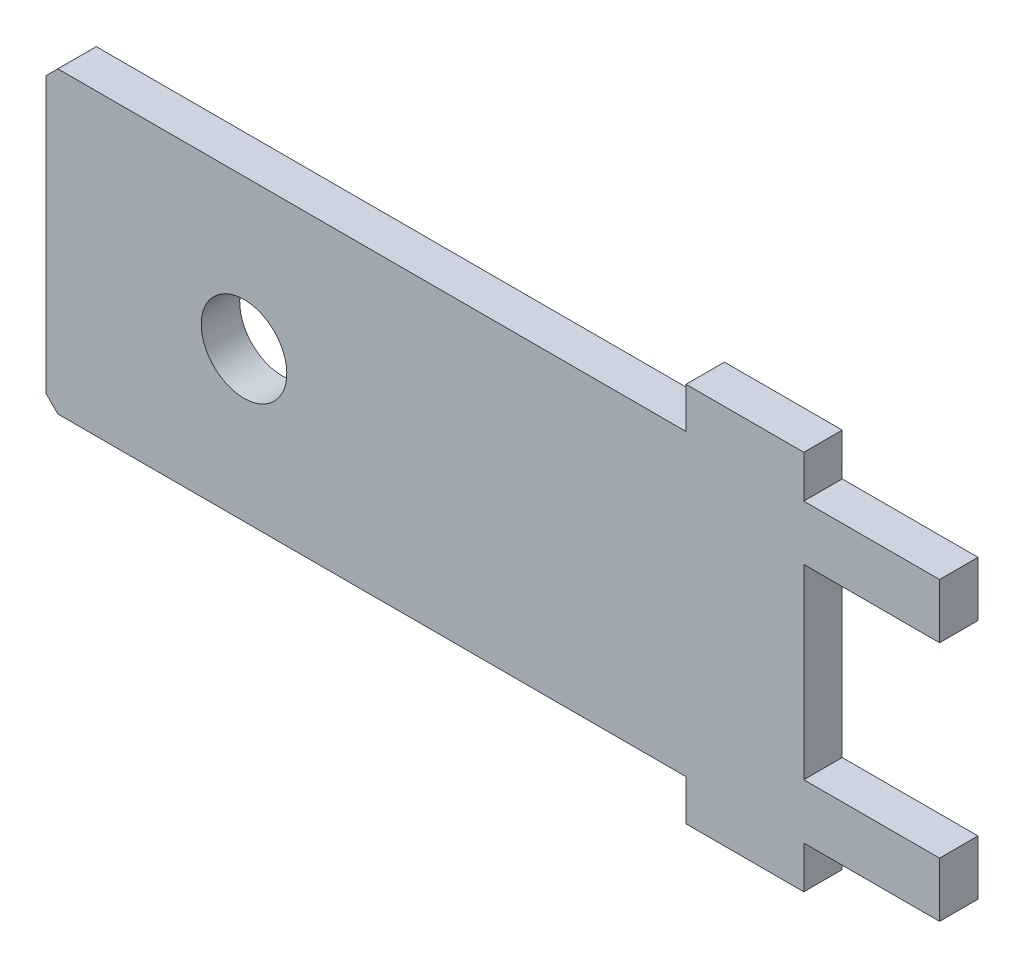
ISO-10303-21;
HEADER;
FILE_DESCRIPTION(('STEP AP214'),'2;1');
FILE_NAME('part.step','',(''),(''),'','','');
FILE_SCHEMA(('AUTOMOTIVE_DESIGN { 1 0 10303 214 1 1 1 1 }'));
ENDSEC;
DATA;
#1=APPLICATION_CONTEXT('core data for automotive mechanical design processes');
#2=APPLICATION_PROTOCOL_DEFINITION('international standard','automotive_design',2000,#1);
#3=PRODUCT_CONTEXT('',#1,'mechanical');
#4=PRODUCT('Part','Part','',(#3));
#5=PRODUCT_RELATED_PRODUCT_CATEGORY('part','',(#4));
#6=PRODUCT_DEFINITION_FORMATION('','',#4);
#7=PRODUCT_DEFINITION_CONTEXT('part definition',#1,'design');
#8=PRODUCT_DEFINITION('design','',#6,#7);
#9=PRODUCT_DEFINITION_SHAPE('','',#8);
#10=(LENGTH_UNIT() NAMED_UNIT(*) SI_UNIT(.MILLI.,.METRE.));
#11=(NAMED_UNIT(*) PLANE_ANGLE_UNIT() SI_UNIT($,.RADIAN.));
#12=(NAMED_UNIT(*) SI_UNIT($,.STERADIAN.) SOLID_ANGLE_UNIT());
#13=UNCERTAINTY_MEASURE_WITH_UNIT(LENGTH_MEASURE(1.E-05),#10,'distance_accuracy_value','');
#14=(GEOMETRIC_REPRESENTATION_CONTEXT(3) GLOBAL_UNCERTAINTY_ASSIGNED_CONTEXT((#13)) GLOBAL_UNIT_ASSIGNED_CONTEXT((#10,
#11,#12)) REPRESENTATION_CONTEXT('',''));
#15=CARTESIAN_POINT('',(0.,0.,0.));
#16=DIRECTION('',(0.,0.,1.));
#17=DIRECTION('',(1.,0.,0.));
#18=AXIS2_PLACEMENT_3D('',#15,#16,#17);
#19=CARTESIAN_POINT('',(-0.0340000000000023,-1.94,0.8));
#20=DIRECTION('',(-1.,0.,0.));
#21=DIRECTION('',(0.,0.,1.));
#22=AXIS2_PLACEMENT_3D('',#19,#20,#21);
#23=PLANE('',#22);
#24=DIRECTION('',(0.,1.,0.));
#25=VECTOR('',#24,1.);
#26=CARTESIAN_POINT('',(-0.0340000000000023,-1.94,0.));
#27=LINE('',#26,#25);
#28=CARTESIAN_POINT('',(-0.0340000000000023,-1.94,0.));
#29=VERTEX_POINT('',#28);
#30=CARTESIAN_POINT('',(-0.0340000000000023,1.94,0.));
#31=VERTEX_POINT('',#30);
#32=EDGE_CURVE('E186',#29,#31,#27,.T.);
#33=ORIENTED_EDGE('',*,*,#32,.T.);
#34=DIRECTION('',(0.,0.,-1.));
#35=VECTOR('',#34,1.);
#36=CARTESIAN_POINT('',(-0.0340000000000023,1.94,0.8));
#37=LINE('',#36,#35);
#38=CARTESIAN_POINT('',(-0.0340000000000023,1.94,0.8));
#39=VERTEX_POINT('',#38);
#40=EDGE_CURVE('E167',#39,#31,#37,.T.);
#41=ORIENTED_EDGE('',*,*,#40,.F.);
#42=DIRECTION('',(0.,1.,0.));
#43=VECTOR('',#42,1.);
#44=CARTESIAN_POINT('',(-0.0340000000000023,-1.94,0.8));
#45=LINE('',#44,#43);
#46=CARTESIAN_POINT('',(-0.0340000000000023,-1.94,0.8));
#47=VERTEX_POINT('',#46);
#48=EDGE_CURVE('E174',#47,#39,#45,.T.);
#49=ORIENTED_EDGE('',*,*,#48,.F.);
#50=DIRECTION('',(0.,0.,-1.));
#51=VECTOR('',#50,1.);
#52=CARTESIAN_POINT('',(-0.0340000000000023,-1.94,0.8));
#53=LINE('',#52,#51);
#54=EDGE_CURVE('E237',#47,#29,#53,.T.);
#55=ORIENTED_EDGE('',*,*,#54,.T.);
#56=EDGE_LOOP('',(#33,#41,#49,#55));
#57=FACE_BOUND('',#56,.T.);
#58=ADVANCED_FACE('F33',(#57),#23,.F.);
#59=CARTESIAN_POINT('',(-0.0340000000000023,1.94,0.8));
#60=DIRECTION('',(0.,1.,0.));
#61=DIRECTION('',(-1.,0.,0.));
#62=AXIS2_PLACEMENT_3D('',#59,#60,#61);
#63=PLANE('',#62);
#64=DIRECTION('',(1.,0.,0.));
#65=VECTOR('',#64,1.);
#66=CARTESIAN_POINT('',(-0.0340000000000023,1.94,0.));
#67=LINE('',#66,#65);
#68=CARTESIAN_POINT('',(2.79108259057112,1.94,0.));
#69=VERTEX_POINT('',#68);
#70=EDGE_CURVE('E239',#31,#69,#67,.T.);
#71=ORIENTED_EDGE('',*,*,#70,.T.);
#72=DIRECTION('',(0.,0.,-1.));
#73=VECTOR('',#72,1.);
#74=CARTESIAN_POINT('',(2.79108259057112,1.94,0.8));
#75=LINE('',#74,#73);
#76=CARTESIAN_POINT('',(2.79108259057112,1.94,0.8));
#77=VERTEX_POINT('',#76);
#78=EDGE_CURVE('E170',#77,#69,#75,.T.);
#79=ORIENTED_EDGE('',*,*,#78,.F.);
#80=DIRECTION('',(1.,0.,0.));
#81=VECTOR('',#80,1.);
#82=CARTESIAN_POINT('',(-0.0340000000000023,1.94,0.8));
#83=LINE('',#82,#81);
#84=EDGE_CURVE('E163',#39,#77,#83,.T.);
#85=ORIENTED_EDGE('',*,*,#84,.F.);
#86=ORIENTED_EDGE('',*,*,#40,.T.);
#87=EDGE_LOOP('',(#71,#79,#85,#86));
#88=FACE_BOUND('',#87,.T.);
#89=ADVANCED_FACE('F165',(#88),#63,.F.);
#90=CARTESIAN_POINT('',(2.79108259057112,3.08,0.8));
#91=DIRECTION('',(-1.,0.,0.));
#92=DIRECTION('',(0.,-1.,0.));
#93=AXIS2_PLACEMENT_3D('',#90,#91,#92);
#94=PLANE('',#93);
#95=DIRECTION('',(0.,1.,0.));
#96=VECTOR('',#95,1.);
#97=CARTESIAN_POINT('',(2.79108259057112,3.08,0.));
#98=LINE('',#97,#96);
#99=CARTESIAN_POINT('',(2.79108259057112,3.08,0.));
#100=VERTEX_POINT('',#99);
#101=EDGE_CURVE('E242',#69,#100,#98,.T.);
#102=ORIENTED_EDGE('',*,*,#101,.T.);
#103=DIRECTION('',(0.,0.,-1.));
#104=VECTOR('',#103,1.);
#105=CARTESIAN_POINT('',(2.79108259057112,3.08,0.8));
#106=LINE('',#105,#104);
#107=CARTESIAN_POINT('',(2.79108259057112,3.08,0.8));
#108=VERTEX_POINT('',#107);
#109=EDGE_CURVE('E191',#108,#100,#106,.T.);
#110=ORIENTED_EDGE('',*,*,#109,.F.);
#111=DIRECTION('',(0.,1.,0.));
#112=VECTOR('',#111,1.);
#113=CARTESIAN_POINT('',(2.79108259057112,3.08,0.8));
#114=LINE('',#113,#112);
#115=EDGE_CURVE('E173',#77,#108,#114,.T.);
#116=ORIENTED_EDGE('',*,*,#115,.F.);
#117=ORIENTED_EDGE('',*,*,#78,.T.);
#118=EDGE_LOOP('',(#102,#110,#116,#117));
#119=FACE_BOUND('',#118,.T.);
#120=ADVANCED_FACE('F367',(#119),#94,.F.);
#121=CARTESIAN_POINT('',(-0.0340000000000027,3.08,0.8));
#122=DIRECTION('',(0.,-1.,0.));
#123=DIRECTION('',(0.,0.,-1.));
#124=AXIS2_PLACEMENT_3D('',#121,#122,#123);
#125=PLANE('',#124);
#126=DIRECTION('',(-1.,0.,0.));
#127=VECTOR('',#126,1.);
#128=CARTESIAN_POINT('',(-0.0340000000000027,3.08,0.));
#129=LINE('',#128,#127);
#130=CARTESIAN_POINT('',(-0.0340000000000027,3.08,0.));
#131=VERTEX_POINT('',#130);
#132=EDGE_CURVE('E244',#100,#131,#129,.T.);
#133=ORIENTED_EDGE('',*,*,#132,.T.);
#134=DIRECTION('',(0.,0.,-1.));
#135=VECTOR('',#134,1.);
#136=CARTESIAN_POINT('',(-0.0340000000000027,3.08,0.8));
#137=LINE('',#136,#135);
#138=CARTESIAN_POINT('',(-0.0340000000000027,3.08,0.8));
#139=VERTEX_POINT('',#138);
#140=EDGE_CURVE('E305',#139,#131,#137,.T.);
#141=ORIENTED_EDGE('',*,*,#140,.F.);
#142=DIRECTION('',(-1.,0.,0.));
#143=VECTOR('',#142,1.);
#144=CARTESIAN_POINT('',(-0.0340000000000027,3.08,0.8));
#145=LINE('',#144,#143);
#146=EDGE_CURVE('E314',#108,#139,#145,.T.);
#147=ORIENTED_EDGE('',*,*,#146,.F.);
#148=ORIENTED_EDGE('',*,*,#109,.T.);
#149=EDGE_LOOP('',(#133,#141,#147,#148));
#150=FACE_BOUND('',#149,.T.);
#151=ADVANCED_FACE('F312',(#150),#125,.F.);
#152=CARTESIAN_POINT('',(-0.0340000000000027,3.08,0.8));
#153=DIRECTION('',(-1.,0.,0.));
#154=DIRECTION('',(0.,-1.,0.));
#155=AXIS2_PLACEMENT_3D('',#152,#153,#154);
#156=PLANE('',#155);
#157=DIRECTION('',(0.,1.,0.));
#158=VECTOR('',#157,1.);
#159=CARTESIAN_POINT('',(-0.0340000000000027,3.08,0.));
#160=LINE('',#159,#158);
#161=CARTESIAN_POINT('',(-0.0339999999999997,3.96,0.));
#162=VERTEX_POINT('',#161);
#163=EDGE_CURVE('E246',#131,#162,#160,.T.);
#164=ORIENTED_EDGE('',*,*,#163,.T.);
#165=DIRECTION('',(0.,0.,-1.));
#166=VECTOR('',#165,1.);
#167=CARTESIAN_POINT('',(-0.0339999999999997,3.96,0.8));
#168=LINE('',#167,#166);
#169=CARTESIAN_POINT('',(-0.0339999999999997,3.96,0.8));
#170=VERTEX_POINT('',#169);
#171=EDGE_CURVE('E302',#170,#162,#168,.T.);
#172=ORIENTED_EDGE('',*,*,#171,.F.);
#173=DIRECTION('',(0.,1.,0.));
#174=VECTOR('',#173,1.);
#175=CARTESIAN_POINT('',(-0.0340000000000027,3.08,0.8));
#176=LINE('',#175,#174);
#177=EDGE_CURVE('E332',#139,#170,#176,.T.);
#178=ORIENTED_EDGE('',*,*,#177,.F.);
#179=ORIENTED_EDGE('',*,*,#140,.T.);
#180=EDGE_LOOP('',(#164,#172,#178,#179));
#181=FACE_BOUND('',#180,.T.);
#182=ADVANCED_FACE('F324',(#181),#156,.F.);
#183=CARTESIAN_POINT('',(-0.0339999999999997,3.96,0.8));
#184=DIRECTION('',(0.,-1.,0.));
#185=DIRECTION('',(0.,0.,-1.));
#186=AXIS2_PLACEMENT_3D('',#183,#184,#185);
#187=PLANE('',#186);
#188=DIRECTION('',(-1.,0.,0.));
#189=VECTOR('',#188,1.);
#190=CARTESIAN_POINT('',(-0.0339999999999997,3.96,0.));
#191=LINE('',#190,#189);
#192=CARTESIAN_POINT('',(-2.484,3.96,0.));
#193=VERTEX_POINT('',#192);
#194=EDGE_CURVE('E248',#162,#193,#191,.T.);
#195=ORIENTED_EDGE('',*,*,#194,.T.);
#196=DIRECTION('',(0.,0.,-1.));
#197=VECTOR('',#196,1.);
#198=CARTESIAN_POINT('',(-2.484,3.96,0.8));
#199=LINE('',#198,#197);
#200=CARTESIAN_POINT('',(-2.484,3.96,0.8));
#201=VERTEX_POINT('',#200);
#202=EDGE_CURVE('E299',#201,#193,#199,.T.);
#203=ORIENTED_EDGE('',*,*,#202,.F.);
#204=DIRECTION('',(-1.,0.,0.));
#205=VECTOR('',#204,1.);
#206=CARTESIAN_POINT('',(-0.0339999999999997,3.96,0.8));
#207=LINE('',#206,#205);
#208=EDGE_CURVE('E330',#170,#201,#207,.T.);
#209=ORIENTED_EDGE('',*,*,#208,.F.);
#210=ORIENTED_EDGE('',*,*,#171,.T.);
#211=EDGE_LOOP('',(#195,#203,#209,#210));
#212=FACE_BOUND('',#211,.T.);
#213=ADVANCED_FACE('F328',(#212),#187,.F.);
#214=CARTESIAN_POINT('',(-2.484,3.96,0.8));
#215=DIRECTION('',(1.,0.,0.));
#216=DIRECTION('',(0.,0.,-1.));
#217=AXIS2_PLACEMENT_3D('',#214,#215,#216);
#218=PLANE('',#217);
#219=DIRECTION('',(0.,-1.,0.));
#220=VECTOR('',#219,1.);
#221=CARTESIAN_POINT('',(-2.484,3.96,0.));
#222=LINE('',#221,#220);
#223=CARTESIAN_POINT('',(-2.484,3.11,0.));
#224=VERTEX_POINT('',#223);
#225=EDGE_CURVE('E250',#193,#224,#222,.T.);
#226=ORIENTED_EDGE('',*,*,#225,.T.);
#227=DIRECTION('',(0.,0.,-1.));
#228=VECTOR('',#227,1.);
#229=CARTESIAN_POINT('',(-2.484,3.11,0.8));
#230=LINE('',#229,#228);
#231=CARTESIAN_POINT('',(-2.484,3.11,0.8));
#232=VERTEX_POINT('',#231);
#233=EDGE_CURVE('E296',#232,#224,#230,.T.);
#234=ORIENTED_EDGE('',*,*,#233,.F.);
#235=DIRECTION('',(0.,-1.,0.));
#236=VECTOR('',#235,1.);
#237=CARTESIAN_POINT('',(-2.484,3.96,0.8));
#238=LINE('',#237,#236);
#239=EDGE_CURVE('E221',#201,#232,#238,.T.);
#240=ORIENTED_EDGE('',*,*,#239,.F.);
#241=ORIENTED_EDGE('',*,*,#202,.T.);
#242=EDGE_LOOP('',(#226,#234,#240,#241));
#243=FACE_BOUND('',#242,.T.);
#244=ADVANCED_FACE('F488',(#243),#218,.F.);
#245=CARTESIAN_POINT('',(-2.484,3.11,0.8));
#246=DIRECTION('',(0.,-1.,0.));
#247=DIRECTION('',(0.,0.,-1.));
#248=AXIS2_PLACEMENT_3D('',#245,#246,#247);
#249=PLANE('',#248);
#250=DIRECTION('',(-1.,0.,0.));
#251=VECTOR('',#250,1.);
#252=CARTESIAN_POINT('',(-2.484,3.11,0.));
#253=LINE('',#252,#251);
#254=CARTESIAN_POINT('',(-15.5531599594194,3.11,0.));
#255=VERTEX_POINT('',#254);
#256=EDGE_CURVE('E252',#224,#255,#253,.T.);
#257=ORIENTED_EDGE('',*,*,#256,.T.);
#258=DIRECTION('',(0.,0.,-1.));
#259=VECTOR('',#258,1.);
#260=CARTESIAN_POINT('',(-15.5531599594194,3.11,0.8));
#261=LINE('',#260,#259);
#262=CARTESIAN_POINT('',(-15.5531599594194,3.11,0.8));
#263=VERTEX_POINT('',#262);
#264=EDGE_CURVE('E294',#263,#255,#261,.T.);
#265=ORIENTED_EDGE('',*,*,#264,.F.);
#266=DIRECTION('',(-1.,0.,0.));
#267=VECTOR('',#266,1.);
#268=CARTESIAN_POINT('',(-2.484,3.11,0.8));
#269=LINE('',#268,#267);
#270=EDGE_CURVE('E215',#232,#263,#269,.T.);
#271=ORIENTED_EDGE('',*,*,#270,.F.);
#272=ORIENTED_EDGE('',*,*,#233,.T.);
#273=EDGE_LOOP('',(#257,#265,#271,#272));
#274=FACE_BOUND('',#273,.T.);
#275=ADVANCED_FACE('F408',(#274),#249,.F.);
#276=CARTESIAN_POINT('',(-16.2,2.46435108659646,0.8));
#277=DIRECTION('',(0.706454828344419,-0.707758133481246,0.));
#278=DIRECTION('',(0.707758133481246,0.706454828344419,0.));
#279=AXIS2_PLACEMENT_3D('',#276,#277,#278);
#280=PLANE('',#279);
#281=DIRECTION('',(-0.577704657206457,-0.576640839764187,0.577704657206452));
#282=VECTOR('',#281,1.);
#283=CARTESIAN_POINT('',(-16.2,2.46435108659646,0.400000000000001));
#284=LINE('',#283,#282);
#285=CARTESIAN_POINT('',(-15.8,2.86361450437993,0.));
#286=VERTEX_POINT('',#285);
#287=CARTESIAN_POINT('',(-16.2,2.46435108659646,0.400000000000001));
#288=VERTEX_POINT('',#287);
#289=EDGE_CURVE('E198',#286,#288,#284,.T.);
#290=ORIENTED_EDGE('',*,*,#289,.T.);
#291=DIRECTION('',(-0.577704657206455,-0.576640839764185,-0.577704657206455));
#292=VECTOR('',#291,1.);
#293=CARTESIAN_POINT('',(-15.7279159112649,2.93556585347036,0.872084088735078));
#294=LINE('',#293,#292);
#295=CARTESIAN_POINT('',(-15.8,2.86361450437992,0.8));
#296=VERTEX_POINT('',#295);
#297=EDGE_CURVE('E11',#288,#296,#294,.F.);
#298=ORIENTED_EDGE('',*,*,#297,.T.);
#299=DIRECTION('',(-0.707758133481246,-0.706454828344419,0.));
#300=VECTOR('',#299,1.);
#301=CARTESIAN_POINT('',(-16.2,2.46435108659646,0.8));
#302=LINE('',#301,#300);
#303=EDGE_CURVE('E213',#263,#296,#302,.T.);
#304=ORIENTED_EDGE('',*,*,#303,.F.);
#305=ORIENTED_EDGE('',*,*,#264,.T.);
#306=DIRECTION('',(-0.707758133481246,-0.706454828344419,0.));
#307=VECTOR('',#306,1.);
#308=CARTESIAN_POINT('',(-16.2,2.46435108659646,0.));
#309=LINE('',#308,#307);
#310=EDGE_CURVE('E254',#255,#286,#309,.T.);
#311=ORIENTED_EDGE('',*,*,#310,.T.);
#312=EDGE_LOOP('',(#290,#298,#304,#305,#311));
#313=FACE_BOUND('',#312,.T.);
#314=ADVANCED_FACE('F397',(#313),#280,.F.);
#315=CARTESIAN_POINT('',(-16.2,-2.46435108659645,0.8));
#316=DIRECTION('',(0.706454828344419,0.707758133481246,0.));
#317=DIRECTION('',(-0.707758133481246,0.706454828344419,0.));
#318=AXIS2_PLACEMENT_3D('',#315,#316,#317);
#319=PLANE('',#318);
#320=DIRECTION('',(0.707758133481246,-0.706454828344419,0.));
#321=VECTOR('',#320,1.);
#322=CARTESIAN_POINT('',(-16.2,-2.46435108659645,0.8));
#323=LINE('',#322,#321);
#324=CARTESIAN_POINT('',(-15.8,-2.86361450437992,0.8));
#325=VERTEX_POINT('',#324);
#326=CARTESIAN_POINT('',(-15.5531599594194,-3.11,0.8));
#327=VERTEX_POINT('',#326);
#328=EDGE_CURVE('E207',#325,#327,#323,.T.);
#329=ORIENTED_EDGE('',*,*,#328,.F.);
#330=DIRECTION('',(0.577704657206455,-0.576640839764185,0.577704657206455));
#331=VECTOR('',#330,1.);
#332=CARTESIAN_POINT('',(-17.7799849990549,-0.887275559673258,-1.17998499905494));
#333=LINE('',#332,#331);
#334=CARTESIAN_POINT('',(-16.2,-2.46435108659645,0.400000000000001));
#335=VERTEX_POINT('',#334);
#336=EDGE_CURVE('E41',#325,#335,#333,.F.);
#337=ORIENTED_EDGE('',*,*,#336,.T.);
#338=DIRECTION('',(0.577704657206457,-0.576640839764187,-0.577704657206452));
#339=VECTOR('',#338,1.);
#340=CARTESIAN_POINT('',(-17.8418891838527,-0.825485368679609,2.0418891838527));
#341=LINE('',#340,#339);
#342=CARTESIAN_POINT('',(-15.8,-2.86361450437992,0.));
#343=VERTEX_POINT('',#342);
#344=EDGE_CURVE('E189',#335,#343,#341,.T.);
#345=ORIENTED_EDGE('',*,*,#344,.T.);
#346=DIRECTION('',(0.707758133481246,-0.706454828344419,0.));
#347=VECTOR('',#346,1.);
#348=CARTESIAN_POINT('',(-16.2,-2.46435108659645,0.));
#349=LINE('',#348,#347);
#350=CARTESIAN_POINT('',(-15.5531599594194,-3.11,0.));
#351=VERTEX_POINT('',#350);
#352=EDGE_CURVE('E257',#343,#351,#349,.T.);
#353=ORIENTED_EDGE('',*,*,#352,.T.);
#354=DIRECTION('',(0.,0.,-1.));
#355=VECTOR('',#354,1.);
#356=CARTESIAN_POINT('',(-15.5531599594194,-3.11,0.8));
#357=LINE('',#356,#355);
#358=EDGE_CURVE('E291',#327,#351,#357,.T.);
#359=ORIENTED_EDGE('',*,*,#358,.F.);
#360=EDGE_LOOP('',(#329,#337,#345,#353,#359));
#361=FACE_BOUND('',#360,.T.);
#362=ADVANCED_FACE('F204',(#361),#319,.F.);
#363=CARTESIAN_POINT('',(-2.484,-3.11,0.8));
#364=DIRECTION('',(0.,1.,0.));
#365=DIRECTION('',(0.,0.,1.));
#366=AXIS2_PLACEMENT_3D('',#363,#364,#365);
#367=PLANE('',#366);
#368=DIRECTION('',(1.,0.,0.));
#369=VECTOR('',#368,1.);
#370=CARTESIAN_POINT('',(-2.484,-3.11,0.));
#371=LINE('',#370,#369);
#372=CARTESIAN_POINT('',(-2.484,-3.11,0.));
#373=VERTEX_POINT('',#372);
#374=EDGE_CURVE('E259',#351,#373,#371,.T.);
#375=ORIENTED_EDGE('',*,*,#374,.T.);
#376=DIRECTION('',(0.,0.,-1.));
#377=VECTOR('',#376,1.);
#378=CARTESIAN_POINT('',(-2.484,-3.11,0.8));
#379=LINE('',#378,#377);
#380=CARTESIAN_POINT('',(-2.484,-3.11,0.8));
#381=VERTEX_POINT('',#380);
#382=EDGE_CURVE('E288',#381,#373,#379,.T.);
#383=ORIENTED_EDGE('',*,*,#382,.F.);
#384=DIRECTION('',(1.,0.,0.));
#385=VECTOR('',#384,1.);
#386=CARTESIAN_POINT('',(-2.484,-3.11,0.8));
#387=LINE('',#386,#385);
#388=EDGE_CURVE('E219',#327,#381,#387,.T.);
#389=ORIENTED_EDGE('',*,*,#388,.F.);
#390=ORIENTED_EDGE('',*,*,#358,.T.);
#391=EDGE_LOOP('',(#375,#383,#389,#390));
#392=FACE_BOUND('',#391,.T.);
#393=ADVANCED_FACE('F396',(#392),#367,.F.);
#394=CARTESIAN_POINT('',(-2.484,-3.96,0.8));
#395=DIRECTION('',(1.,0.,0.));
#396=DIRECTION('',(0.,0.,-1.));
#397=AXIS2_PLACEMENT_3D('',#394,#395,#396);
#398=PLANE('',#397);
#399=DIRECTION('',(0.,-1.,0.));
#400=VECTOR('',#399,1.);
#401=CARTESIAN_POINT('',(-2.484,-3.96,0.));
#402=LINE('',#401,#400);
#403=CARTESIAN_POINT('',(-2.484,-3.96,0.));
#404=VERTEX_POINT('',#403);
#405=EDGE_CURVE('E261',#373,#404,#402,.T.);
#406=ORIENTED_EDGE('',*,*,#405,.T.);
#407=DIRECTION('',(0.,0.,-1.));
#408=VECTOR('',#407,1.);
#409=CARTESIAN_POINT('',(-2.484,-3.96,0.8));
#410=LINE('',#409,#408);
#411=CARTESIAN_POINT('',(-2.484,-3.96,0.8));
#412=VERTEX_POINT('',#411);
#413=EDGE_CURVE('E285',#412,#404,#410,.T.);
#414=ORIENTED_EDGE('',*,*,#413,.F.);
#415=DIRECTION('',(0.,-1.,0.));
#416=VECTOR('',#415,1.);
#417=CARTESIAN_POINT('',(-2.484,-3.96,0.8));
#418=LINE('',#417,#416);
#419=EDGE_CURVE('E226',#381,#412,#418,.T.);
#420=ORIENTED_EDGE('',*,*,#419,.F.);
#421=ORIENTED_EDGE('',*,*,#382,.T.);
#422=EDGE_LOOP('',(#406,#414,#420,#421));
#423=FACE_BOUND('',#422,.T.);
#424=ADVANCED_FACE('F464',(#423),#398,.F.);
#425=CARTESIAN_POINT('',(-0.0339999999999997,-3.96,0.8));
#426=DIRECTION('',(0.,1.,0.));
#427=DIRECTION('',(0.,0.,1.));
#428=AXIS2_PLACEMENT_3D('',#425,#426,#427);
#429=PLANE('',#428);
#430=DIRECTION('',(1.,0.,0.));
#431=VECTOR('',#430,1.);
#432=CARTESIAN_POINT('',(-0.0339999999999997,-3.96,0.));
#433=LINE('',#432,#431);
#434=CARTESIAN_POINT('',(-0.0339999999999997,-3.96,0.));
#435=VERTEX_POINT('',#434);
#436=EDGE_CURVE('E263',#404,#435,#433,.T.);
#437=ORIENTED_EDGE('',*,*,#436,.T.);
#438=DIRECTION('',(0.,0.,-1.));
#439=VECTOR('',#438,1.);
#440=CARTESIAN_POINT('',(-0.0339999999999997,-3.96,0.8));
#441=LINE('',#440,#439);
#442=CARTESIAN_POINT('',(-0.0339999999999997,-3.96,0.8));
#443=VERTEX_POINT('',#442);
#444=EDGE_CURVE('E282',#443,#435,#441,.T.);
#445=ORIENTED_EDGE('',*,*,#444,.F.);
#446=DIRECTION('',(1.,0.,0.));
#447=VECTOR('',#446,1.);
#448=CARTESIAN_POINT('',(-0.0339999999999997,-3.96,0.8));
#449=LINE('',#448,#447);
#450=EDGE_CURVE('E228',#412,#443,#449,.T.);
#451=ORIENTED_EDGE('',*,*,#450,.F.);
#452=ORIENTED_EDGE('',*,*,#413,.T.);
#453=EDGE_LOOP('',(#437,#445,#451,#452));
#454=FACE_BOUND('',#453,.T.);
#455=ADVANCED_FACE('F454',(#454),#429,.F.);
#456=CARTESIAN_POINT('',(-0.0339999999999997,-3.96,0.8));
#457=DIRECTION('',(-1.,0.,0.));
#458=DIRECTION('',(0.,-1.,0.));
#459=AXIS2_PLACEMENT_3D('',#456,#457,#458);
#460=PLANE('',#459);
#461=DIRECTION('',(0.,1.,0.));
#462=VECTOR('',#461,1.);
#463=CARTESIAN_POINT('',(-0.0339999999999997,-3.96,0.));
#464=LINE('',#463,#462);
#465=CARTESIAN_POINT('',(-0.0340000000000027,-3.08,0.));
#466=VERTEX_POINT('',#465);
#467=EDGE_CURVE('E265',#435,#466,#464,.T.);
#468=ORIENTED_EDGE('',*,*,#467,.T.);
#469=DIRECTION('',(0.,0.,-1.));
#470=VECTOR('',#469,1.);
#471=CARTESIAN_POINT('',(-0.0340000000000027,-3.08,0.8));
#472=LINE('',#471,#470);
#473=CARTESIAN_POINT('',(-0.0340000000000027,-3.08,0.8));
#474=VERTEX_POINT('',#473);
#475=EDGE_CURVE('E279',#474,#466,#472,.T.);
#476=ORIENTED_EDGE('',*,*,#475,.F.);
#477=DIRECTION('',(0.,1.,0.));
#478=VECTOR('',#477,1.);
#479=CARTESIAN_POINT('',(-0.0339999999999997,-3.96,0.8));
#480=LINE('',#479,#478);
#481=EDGE_CURVE('E230',#443,#474,#480,.T.);
#482=ORIENTED_EDGE('',*,*,#481,.F.);
#483=ORIENTED_EDGE('',*,*,#444,.T.);
#484=EDGE_LOOP('',(#468,#476,#482,#483));
#485=FACE_BOUND('',#484,.T.);
#486=ADVANCED_FACE('F444',(#485),#460,.F.);
#487=CARTESIAN_POINT('',(-0.0340000000000027,-3.08,0.8));
#488=DIRECTION('',(0.,1.,0.));
#489=DIRECTION('',(0.,0.,1.));
#490=AXIS2_PLACEMENT_3D('',#487,#488,#489);
#491=PLANE('',#490);
#492=DIRECTION('',(1.,0.,0.));
#493=VECTOR('',#492,1.);
#494=CARTESIAN_POINT('',(-0.0340000000000027,-3.08,0.));
#495=LINE('',#494,#493);
#496=CARTESIAN_POINT('',(2.79108259057112,-3.08,0.));
#497=VERTEX_POINT('',#496);
#498=EDGE_CURVE('E267',#466,#497,#495,.T.);
#499=ORIENTED_EDGE('',*,*,#498,.T.);
#500=DIRECTION('',(0.,0.,-1.));
#501=VECTOR('',#500,1.);
#502=CARTESIAN_POINT('',(2.79108259057112,-3.08,0.8));
#503=LINE('',#502,#501);
#504=CARTESIAN_POINT('',(2.79108259057112,-3.08,0.8));
#505=VERTEX_POINT('',#504);
#506=EDGE_CURVE('E276',#505,#497,#503,.T.);
#507=ORIENTED_EDGE('',*,*,#506,.F.);
#508=DIRECTION('',(1.,0.,0.));
#509=VECTOR('',#508,1.);
#510=CARTESIAN_POINT('',(-0.0340000000000027,-3.08,0.8));
#511=LINE('',#510,#509);
#512=EDGE_CURVE('E232',#474,#505,#511,.T.);
#513=ORIENTED_EDGE('',*,*,#512,.F.);
#514=ORIENTED_EDGE('',*,*,#475,.T.);
#515=EDGE_LOOP('',(#499,#507,#513,#514));
#516=FACE_BOUND('',#515,.T.);
#517=ADVANCED_FACE('F434',(#516),#491,.F.);
#518=CARTESIAN_POINT('',(2.79108259057112,-3.08,0.8));
#519=DIRECTION('',(-1.,0.,0.));
#520=DIRECTION('',(0.,-1.,0.));
#521=AXIS2_PLACEMENT_3D('',#518,#519,#520);
#522=PLANE('',#521);
#523=DIRECTION('',(0.,1.,0.));
#524=VECTOR('',#523,1.);
#525=CARTESIAN_POINT('',(2.79108259057112,-3.08,0.));
#526=LINE('',#525,#524);
#527=CARTESIAN_POINT('',(2.79108259057112,-1.94,0.));
#528=VERTEX_POINT('',#527);
#529=EDGE_CURVE('E269',#497,#528,#526,.T.);
#530=ORIENTED_EDGE('',*,*,#529,.T.);
#531=DIRECTION('',(0.,0.,-1.));
#532=VECTOR('',#531,1.);
#533=CARTESIAN_POINT('',(2.79108259057112,-1.94,0.8));
#534=LINE('',#533,#532);
#535=CARTESIAN_POINT('',(2.79108259057112,-1.94,0.8));
#536=VERTEX_POINT('',#535);
#537=EDGE_CURVE('E273',#536,#528,#534,.T.);
#538=ORIENTED_EDGE('',*,*,#537,.F.);
#539=DIRECTION('',(0.,1.,0.));
#540=VECTOR('',#539,1.);
#541=CARTESIAN_POINT('',(2.79108259057112,-3.08,0.8));
#542=LINE('',#541,#540);
#543=EDGE_CURVE('E234',#505,#536,#542,.T.);
#544=ORIENTED_EDGE('',*,*,#543,.F.);
#545=ORIENTED_EDGE('',*,*,#506,.T.);
#546=EDGE_LOOP('',(#530,#538,#544,#545));
#547=FACE_BOUND('',#546,.T.);
#548=ADVANCED_FACE('F359',(#547),#522,.F.);
#549=CARTESIAN_POINT('',(-0.0340000000000023,-1.94,0.8));
#550=DIRECTION('',(0.,-1.,0.));
#551=DIRECTION('',(1.,0.,0.));
#552=AXIS2_PLACEMENT_3D('',#549,#550,#551);
#553=PLANE('',#552);
#554=DIRECTION('',(-1.,0.,0.));
#555=VECTOR('',#554,1.);
#556=CARTESIAN_POINT('',(-0.0340000000000023,-1.94,0.));
#557=LINE('',#556,#555);
#558=EDGE_CURVE('E183',#528,#29,#557,.T.);
#559=ORIENTED_EDGE('',*,*,#558,.T.);
#560=ORIENTED_EDGE('',*,*,#54,.F.);
#561=DIRECTION('',(-1.,0.,0.));
#562=VECTOR('',#561,1.);
#563=CARTESIAN_POINT('',(-0.0340000000000023,-1.94,0.8));
#564=LINE('',#563,#562);
#565=EDGE_CURVE('E179',#536,#47,#564,.T.);
#566=ORIENTED_EDGE('',*,*,#565,.F.);
#567=ORIENTED_EDGE('',*,*,#537,.T.);
#568=EDGE_LOOP('',(#559,#560,#566,#567));
#569=FACE_BOUND('',#568,.T.);
#570=ADVANCED_FACE('F352',(#569),#553,.F.);
#571=CARTESIAN_POINT('',(-0.0340000000000023,3.08,0.8));
#572=DIRECTION('',(0.,0.,-1.));
#573=DIRECTION('',(-1.,0.,0.));
#574=AXIS2_PLACEMENT_3D('',#571,#572,#573);
#575=PLANE('',#574);
#576=CARTESIAN_POINT('',(-11.68,0.,0.8));
#577=DIRECTION('',(0.,0.,1.));
#578=DIRECTION('',(0.,-1.,0.));
#579=AXIS2_PLACEMENT_3D('',#576,#577,#578);
#580=CIRCLE('',#579,0.89);
#581=CARTESIAN_POINT('',(-11.68,-0.889999999999999,0.8));
#582=VERTEX_POINT('',#581);
#583=EDGE_CURVE('E338',#582,#582,#580,.T.);
#584=ORIENTED_EDGE('',*,*,#583,.F.);
#585=EDGE_LOOP('',(#584));
#586=FACE_BOUND('',#585,.T.);
#587=ORIENTED_EDGE('',*,*,#303,.T.);
#588=DIRECTION('',(0.,-1.,0.));
#589=VECTOR('',#588,1.);
#590=CARTESIAN_POINT('',(-15.8,3.08,0.8));
#591=LINE('',#590,#589);
#592=EDGE_CURVE('E200',#296,#325,#591,.T.);
#593=ORIENTED_EDGE('',*,*,#592,.T.);
#594=ORIENTED_EDGE('',*,*,#328,.T.);
#595=ORIENTED_EDGE('',*,*,#388,.T.);
#596=ORIENTED_EDGE('',*,*,#419,.T.);
#597=ORIENTED_EDGE('',*,*,#450,.T.);
#598=ORIENTED_EDGE('',*,*,#481,.T.);
#599=ORIENTED_EDGE('',*,*,#512,.T.);
#600=ORIENTED_EDGE('',*,*,#543,.T.);
#601=ORIENTED_EDGE('',*,*,#565,.T.);
#602=ORIENTED_EDGE('',*,*,#48,.T.);
#603=ORIENTED_EDGE('',*,*,#84,.T.);
#604=ORIENTED_EDGE('',*,*,#115,.T.);
#605=ORIENTED_EDGE('',*,*,#146,.T.);
#606=ORIENTED_EDGE('',*,*,#177,.T.);
#607=ORIENTED_EDGE('',*,*,#208,.T.);
#608=ORIENTED_EDGE('',*,*,#239,.T.);
#609=ORIENTED_EDGE('',*,*,#270,.T.);
#610=EDGE_LOOP('',(#587,#593,#594,#595,#596,#597,#598,#599,#600,#601,#602,#603,#604,#605,#606,
#607,#608,#609));
#611=FACE_BOUND('',#610,.T.);
#612=ADVANCED_FACE('F177',(#586,#611),#575,.F.);
#613=CARTESIAN_POINT('',(-0.0340000000000023,3.08,0.));
#614=DIRECTION('',(0.,0.,-1.));
#615=DIRECTION('',(-1.,0.,0.));
#616=AXIS2_PLACEMENT_3D('',#613,#614,#615);
#617=PLANE('',#616);
#618=CARTESIAN_POINT('',(-11.68,0.,0.));
#619=DIRECTION('',(0.,0.,1.));
#620=DIRECTION('',(0.,-1.,0.));
#621=AXIS2_PLACEMENT_3D('',#618,#619,#620);
#622=CIRCLE('',#621,0.89);
#623=CARTESIAN_POINT('',(-11.68,-0.889999999999999,0.));
#624=VERTEX_POINT('',#623);
#625=EDGE_CURVE('E240',#624,#624,#622,.T.);
#626=ORIENTED_EDGE('',*,*,#625,.T.);
#627=EDGE_LOOP('',(#626));
#628=FACE_BOUND('',#627,.T.);
#629=ORIENTED_EDGE('',*,*,#352,.F.);
#630=DIRECTION('',(0.,1.,0.));
#631=VECTOR('',#630,1.);
#632=CARTESIAN_POINT('',(-15.8,2.46435108659646,0.));
#633=LINE('',#632,#631);
#634=EDGE_CURVE('E196',#343,#286,#633,.T.);
#635=ORIENTED_EDGE('',*,*,#634,.T.);
#636=ORIENTED_EDGE('',*,*,#310,.F.);
#637=ORIENTED_EDGE('',*,*,#256,.F.);
#638=ORIENTED_EDGE('',*,*,#225,.F.);
#639=ORIENTED_EDGE('',*,*,#194,.F.);
#640=ORIENTED_EDGE('',*,*,#163,.F.);
#641=ORIENTED_EDGE('',*,*,#132,.F.);
#642=ORIENTED_EDGE('',*,*,#101,.F.);
#643=ORIENTED_EDGE('',*,*,#70,.F.);
#644=ORIENTED_EDGE('',*,*,#32,.F.);
#645=ORIENTED_EDGE('',*,*,#558,.F.);
#646=ORIENTED_EDGE('',*,*,#529,.F.);
#647=ORIENTED_EDGE('',*,*,#498,.F.);
#648=ORIENTED_EDGE('',*,*,#467,.F.);
#649=ORIENTED_EDGE('',*,*,#436,.F.);
#650=ORIENTED_EDGE('',*,*,#405,.F.);
#651=ORIENTED_EDGE('',*,*,#374,.F.);
#652=EDGE_LOOP('',(#629,#635,#636,#637,#638,#639,#640,#641,#642,#643,#644,#645,#646,#647,#648,
#649,#650,#651));
#653=FACE_BOUND('',#652,.T.);
#654=ADVANCED_FACE('F319',(#628,#653),#617,.T.);
#655=CARTESIAN_POINT('',(-11.68,0.,0.));
#656=DIRECTION('',(0.,0.,1.));
#657=DIRECTION('',(0.,-1.,0.));
#658=AXIS2_PLACEMENT_3D('',#655,#656,#657);
#659=CYLINDRICAL_SURFACE('',#658,0.89);
#660=ORIENTED_EDGE('',*,*,#625,.F.);
#661=EDGE_LOOP('',(#660));
#662=FACE_BOUND('',#661,.T.);
#663=ORIENTED_EDGE('',*,*,#583,.T.);
#664=EDGE_LOOP('',(#663));
#665=FACE_BOUND('',#664,.T.);
#666=ADVANCED_FACE('F345',(#662,#665),#659,.F.);
#667=CARTESIAN_POINT('',(-16.2,2.46435108659646,0.400000000000001));
#668=DIRECTION('',(-0.707106781186544,0.,-0.707106781186551));
#669=DIRECTION('',(-0.707106781186551,0.,0.707106781186544));
#670=AXIS2_PLACEMENT_3D('',#667,#668,#669);
#671=PLANE('',#670);
#672=ORIENTED_EDGE('',*,*,#289,.F.);
#673=ORIENTED_EDGE('',*,*,#634,.F.);
#674=ORIENTED_EDGE('',*,*,#344,.F.);
#675=DIRECTION('',(0.,-1.,0.));
#676=VECTOR('',#675,1.);
#677=CARTESIAN_POINT('',(-16.2,-2.46435108659645,0.400000000000001));
#678=LINE('',#677,#676);
#679=EDGE_CURVE('E187',#288,#335,#678,.T.);
#680=ORIENTED_EDGE('',*,*,#679,.F.);
#681=EDGE_LOOP('',(#672,#673,#674,#680));
#682=FACE_BOUND('',#681,.T.);
#683=ADVANCED_FACE('F212',(#682),#671,.T.);
#684=CARTESIAN_POINT('',(-15.8,3.08,0.8));
#685=DIRECTION('',(0.707106781186547,0.,-0.707106781186547));
#686=DIRECTION('',(-0.707106781186548,0.,-0.707106781186548));
#687=AXIS2_PLACEMENT_3D('',#684,#685,#686);
#688=PLANE('',#687);
#689=ORIENTED_EDGE('',*,*,#297,.F.);
#690=ORIENTED_EDGE('',*,*,#679,.T.);
#691=ORIENTED_EDGE('',*,*,#336,.F.);
#692=ORIENTED_EDGE('',*,*,#592,.F.);
#693=EDGE_LOOP('',(#689,#690,#691,#692));
#694=FACE_BOUND('',#693,.T.);
#695=ADVANCED_FACE('F35',(#694),#688,.F.);
#696=CLOSED_SHELL('',(#58,#89,#120,#151,#182,#213,#244,#275,#314,#362,#393,#424,#455,#486,#517,
#548,#570,#612,#654,#666,#683,#695));
#697=MANIFOLD_SOLID_BREP('B2',#696);
#698=ADVANCED_BREP_SHAPE_REPRESENTATION('',(#18,#697),#14);
#699=SHAPE_DEFINITION_REPRESENTATION(#9,#698);
ENDSEC;
END-ISO-10303-21;
